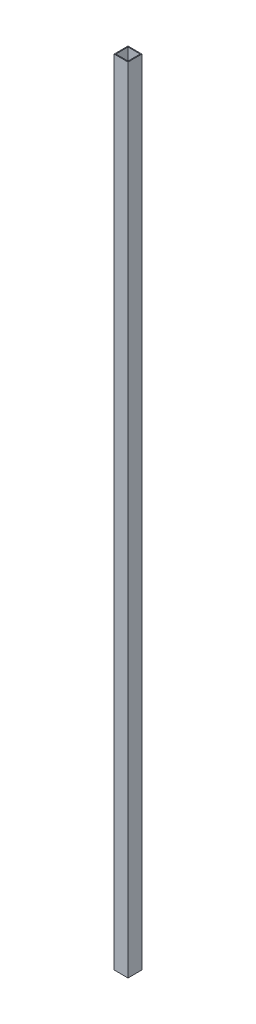
ISO-10303-21;
HEADER;
FILE_DESCRIPTION(('STEP AP214'),'2;1');
FILE_NAME('part.step','',(''),(''),'','','');
FILE_SCHEMA(('AUTOMOTIVE_DESIGN { 1 0 10303 214 1 1 1 1 }'));
ENDSEC;
DATA;
#1=APPLICATION_CONTEXT('core data for automotive mechanical design processes');
#2=APPLICATION_PROTOCOL_DEFINITION('international standard','automotive_design',2000,#1);
#3=PRODUCT_CONTEXT('',#1,'mechanical');
#4=PRODUCT('Part','Part','',(#3));
#5=PRODUCT_RELATED_PRODUCT_CATEGORY('part','',(#4));
#6=PRODUCT_DEFINITION_FORMATION('','',#4);
#7=PRODUCT_DEFINITION_CONTEXT('part definition',#1,'design');
#8=PRODUCT_DEFINITION('design','',#6,#7);
#9=PRODUCT_DEFINITION_SHAPE('','',#8);
#10=(LENGTH_UNIT() NAMED_UNIT(*) SI_UNIT(.MILLI.,.METRE.));
#11=(NAMED_UNIT(*) PLANE_ANGLE_UNIT() SI_UNIT($,.RADIAN.));
#12=(NAMED_UNIT(*) SI_UNIT($,.STERADIAN.) SOLID_ANGLE_UNIT());
#13=UNCERTAINTY_MEASURE_WITH_UNIT(LENGTH_MEASURE(1.E-05),#10,'distance_accuracy_value','');
#14=(GEOMETRIC_REPRESENTATION_CONTEXT(3) GLOBAL_UNCERTAINTY_ASSIGNED_CONTEXT((#13)) GLOBAL_UNIT_ASSIGNED_CONTEXT((#10,
#11,#12)) REPRESENTATION_CONTEXT('',''));
#15=CARTESIAN_POINT('',(0.,0.,0.));
#16=DIRECTION('',(0.,0.,1.));
#17=DIRECTION('',(1.,0.,0.));
#18=AXIS2_PLACEMENT_3D('',#15,#16,#17);
#19=CARTESIAN_POINT('',(0.,1447.8,0.));
#20=DIRECTION('',(0.,-1.,0.));
#21=DIRECTION('',(0.,0.,-1.));
#22=AXIS2_PLACEMENT_3D('',#19,#20,#21);
#23=PLANE('',#22);
#24=DIRECTION('',(0.,0.,-1.));
#25=VECTOR('',#24,1.);
#26=CARTESIAN_POINT('',(12.7,1447.8,12.7));
#27=LINE('',#26,#25);
#28=CARTESIAN_POINT('',(12.7,1447.8,12.7));
#29=VERTEX_POINT('',#28);
#30=CARTESIAN_POINT('',(12.7,1447.8,-12.7));
#31=VERTEX_POINT('',#30);
#32=EDGE_CURVE('E134',#29,#31,#27,.T.);
#33=ORIENTED_EDGE('',*,*,#32,.T.);
#34=DIRECTION('',(-1.,0.,0.));
#35=VECTOR('',#34,1.);
#36=CARTESIAN_POINT('',(-12.7,1447.8,-12.7));
#37=LINE('',#36,#35);
#38=CARTESIAN_POINT('',(-12.7,1447.8,-12.7));
#39=VERTEX_POINT('',#38);
#40=EDGE_CURVE('E137',#31,#39,#37,.T.);
#41=ORIENTED_EDGE('',*,*,#40,.T.);
#42=DIRECTION('',(0.,0.,1.));
#43=VECTOR('',#42,1.);
#44=CARTESIAN_POINT('',(-12.7,1447.8,12.7));
#45=LINE('',#44,#43);
#46=CARTESIAN_POINT('',(-12.7,1447.8,12.7));
#47=VERTEX_POINT('',#46);
#48=EDGE_CURVE('E140',#39,#47,#45,.T.);
#49=ORIENTED_EDGE('',*,*,#48,.T.);
#50=DIRECTION('',(1.,0.,0.));
#51=VECTOR('',#50,1.);
#52=CARTESIAN_POINT('',(-12.7,1447.8,12.7));
#53=LINE('',#52,#51);
#54=EDGE_CURVE('E142',#47,#29,#53,.T.);
#55=ORIENTED_EDGE('',*,*,#54,.T.);
#56=EDGE_LOOP('',(#33,#41,#49,#55));
#57=FACE_BOUND('',#56,.T.);
#58=DIRECTION('',(0.,0.,-1.));
#59=VECTOR('',#58,1.);
#60=CARTESIAN_POINT('',(11.1125,1447.8,11.1125));
#61=LINE('',#60,#59);
#62=CARTESIAN_POINT('',(11.1125,1447.8,11.1125));
#63=VERTEX_POINT('',#62);
#64=CARTESIAN_POINT('',(11.1125,1447.8,-11.1125));
#65=VERTEX_POINT('',#64);
#66=EDGE_CURVE('E98',#63,#65,#61,.T.);
#67=ORIENTED_EDGE('',*,*,#66,.F.);
#68=DIRECTION('',(1.,0.,0.));
#69=VECTOR('',#68,1.);
#70=CARTESIAN_POINT('',(-11.1125,1447.8,11.1125));
#71=LINE('',#70,#69);
#72=CARTESIAN_POINT('',(-11.1125,1447.8,11.1125));
#73=VERTEX_POINT('',#72);
#74=EDGE_CURVE('E120',#73,#63,#71,.T.);
#75=ORIENTED_EDGE('',*,*,#74,.F.);
#76=DIRECTION('',(0.,0.,1.));
#77=VECTOR('',#76,1.);
#78=CARTESIAN_POINT('',(-11.1125,1447.8,11.1125));
#79=LINE('',#78,#77);
#80=CARTESIAN_POINT('',(-11.1125,1447.8,-11.1125));
#81=VERTEX_POINT('',#80);
#82=EDGE_CURVE('E118',#81,#73,#79,.T.);
#83=ORIENTED_EDGE('',*,*,#82,.F.);
#84=DIRECTION('',(-1.,0.,0.));
#85=VECTOR('',#84,1.);
#86=CARTESIAN_POINT('',(-11.1125,1447.8,-11.1125));
#87=LINE('',#86,#85);
#88=EDGE_CURVE('E106',#65,#81,#87,.T.);
#89=ORIENTED_EDGE('',*,*,#88,.F.);
#90=EDGE_LOOP('',(#67,#75,#83,#89));
#91=FACE_BOUND('',#90,.T.);
#92=ADVANCED_FACE('F33',(#57,#91),#23,.F.);
#93=CARTESIAN_POINT('',(0.,0.,0.));
#94=DIRECTION('',(0.,-1.,0.));
#95=DIRECTION('',(0.,0.,-1.));
#96=AXIS2_PLACEMENT_3D('',#93,#94,#95);
#97=PLANE('',#96);
#98=DIRECTION('',(0.,0.,-1.));
#99=VECTOR('',#98,1.);
#100=CARTESIAN_POINT('',(12.7,0.,12.7));
#101=LINE('',#100,#99);
#102=CARTESIAN_POINT('',(12.7,0.,12.7));
#103=VERTEX_POINT('',#102);
#104=CARTESIAN_POINT('',(12.7,0.,-12.7));
#105=VERTEX_POINT('',#104);
#106=EDGE_CURVE('E114',#103,#105,#101,.T.);
#107=ORIENTED_EDGE('',*,*,#106,.F.);
#108=DIRECTION('',(1.,0.,0.));
#109=VECTOR('',#108,1.);
#110=CARTESIAN_POINT('',(-12.7,0.,12.7));
#111=LINE('',#110,#109);
#112=CARTESIAN_POINT('',(-12.7,0.,12.7));
#113=VERTEX_POINT('',#112);
#114=EDGE_CURVE('E138',#113,#103,#111,.T.);
#115=ORIENTED_EDGE('',*,*,#114,.F.);
#116=DIRECTION('',(0.,0.,1.));
#117=VECTOR('',#116,1.);
#118=CARTESIAN_POINT('',(-12.7,0.,12.7));
#119=LINE('',#118,#117);
#120=CARTESIAN_POINT('',(-12.7,0.,-12.7));
#121=VERTEX_POINT('',#120);
#122=EDGE_CURVE('E149',#121,#113,#119,.T.);
#123=ORIENTED_EDGE('',*,*,#122,.F.);
#124=DIRECTION('',(-1.,0.,0.));
#125=VECTOR('',#124,1.);
#126=CARTESIAN_POINT('',(-12.7,0.,-12.7));
#127=LINE('',#126,#125);
#128=EDGE_CURVE('E147',#105,#121,#127,.T.);
#129=ORIENTED_EDGE('',*,*,#128,.F.);
#130=EDGE_LOOP('',(#107,#115,#123,#129));
#131=FACE_BOUND('',#130,.T.);
#132=DIRECTION('',(1.,0.,0.));
#133=VECTOR('',#132,1.);
#134=CARTESIAN_POINT('',(-11.1125,0.,11.1125));
#135=LINE('',#134,#133);
#136=CARTESIAN_POINT('',(-11.1125,0.,11.1125));
#137=VERTEX_POINT('',#136);
#138=CARTESIAN_POINT('',(11.1125,0.,11.1125));
#139=VERTEX_POINT('',#138);
#140=EDGE_CURVE('E107',#137,#139,#135,.T.);
#141=ORIENTED_EDGE('',*,*,#140,.T.);
#142=DIRECTION('',(0.,0.,-1.));
#143=VECTOR('',#142,1.);
#144=CARTESIAN_POINT('',(11.1125,0.,11.1125));
#145=LINE('',#144,#143);
#146=CARTESIAN_POINT('',(11.1125,0.,-11.1125));
#147=VERTEX_POINT('',#146);
#148=EDGE_CURVE('E56',#139,#147,#145,.T.);
#149=ORIENTED_EDGE('',*,*,#148,.T.);
#150=DIRECTION('',(-1.,0.,0.));
#151=VECTOR('',#150,1.);
#152=CARTESIAN_POINT('',(-11.1125,0.,-11.1125));
#153=LINE('',#152,#151);
#154=CARTESIAN_POINT('',(-11.1125,0.,-11.1125));
#155=VERTEX_POINT('',#154);
#156=EDGE_CURVE('E113',#147,#155,#153,.T.);
#157=ORIENTED_EDGE('',*,*,#156,.T.);
#158=DIRECTION('',(0.,0.,1.));
#159=VECTOR('',#158,1.);
#160=CARTESIAN_POINT('',(-11.1125,0.,11.1125));
#161=LINE('',#160,#159);
#162=EDGE_CURVE('E126',#155,#137,#161,.T.);
#163=ORIENTED_EDGE('',*,*,#162,.T.);
#164=EDGE_LOOP('',(#141,#149,#157,#163));
#165=FACE_BOUND('',#164,.T.);
#166=ADVANCED_FACE('F167',(#131,#165),#97,.T.);
#167=CARTESIAN_POINT('',(12.7,1447.8,12.7));
#168=DIRECTION('',(-1.,0.,0.));
#169=DIRECTION('',(0.,0.,1.));
#170=AXIS2_PLACEMENT_3D('',#167,#168,#169);
#171=PLANE('',#170);
#172=ORIENTED_EDGE('',*,*,#106,.T.);
#173=DIRECTION('',(0.,-1.,0.));
#174=VECTOR('',#173,1.);
#175=CARTESIAN_POINT('',(12.7,1447.8,-12.7));
#176=LINE('',#175,#174);
#177=EDGE_CURVE('E11',#31,#105,#176,.T.);
#178=ORIENTED_EDGE('',*,*,#177,.F.);
#179=ORIENTED_EDGE('',*,*,#32,.F.);
#180=DIRECTION('',(0.,-1.,0.));
#181=VECTOR('',#180,1.);
#182=CARTESIAN_POINT('',(12.7,1447.8,12.7));
#183=LINE('',#182,#181);
#184=EDGE_CURVE('E144',#29,#103,#183,.T.);
#185=ORIENTED_EDGE('',*,*,#184,.T.);
#186=EDGE_LOOP('',(#172,#178,#179,#185));
#187=FACE_BOUND('',#186,.T.);
#188=ADVANCED_FACE('F35',(#187),#171,.F.);
#189=CARTESIAN_POINT('',(-12.7,1447.8,-12.7));
#190=DIRECTION('',(0.,0.,1.));
#191=DIRECTION('',(1.,0.,0.));
#192=AXIS2_PLACEMENT_3D('',#189,#190,#191);
#193=PLANE('',#192);
#194=ORIENTED_EDGE('',*,*,#128,.T.);
#195=DIRECTION('',(0.,-1.,0.));
#196=VECTOR('',#195,1.);
#197=CARTESIAN_POINT('',(-12.7,1447.8,-12.7));
#198=LINE('',#197,#196);
#199=EDGE_CURVE('E41',#39,#121,#198,.T.);
#200=ORIENTED_EDGE('',*,*,#199,.F.);
#201=ORIENTED_EDGE('',*,*,#40,.F.);
#202=ORIENTED_EDGE('',*,*,#177,.T.);
#203=EDGE_LOOP('',(#194,#200,#201,#202));
#204=FACE_BOUND('',#203,.T.);
#205=ADVANCED_FACE('F177',(#204),#193,.F.);
#206=CARTESIAN_POINT('',(-12.7,1447.8,12.7));
#207=DIRECTION('',(1.,0.,0.));
#208=DIRECTION('',(0.,0.,-1.));
#209=AXIS2_PLACEMENT_3D('',#206,#207,#208);
#210=PLANE('',#209);
#211=ORIENTED_EDGE('',*,*,#122,.T.);
#212=DIRECTION('',(0.,-1.,0.));
#213=VECTOR('',#212,1.);
#214=CARTESIAN_POINT('',(-12.7,1447.8,12.7));
#215=LINE('',#214,#213);
#216=EDGE_CURVE('E154',#47,#113,#215,.T.);
#217=ORIENTED_EDGE('',*,*,#216,.F.);
#218=ORIENTED_EDGE('',*,*,#48,.F.);
#219=ORIENTED_EDGE('',*,*,#199,.T.);
#220=EDGE_LOOP('',(#211,#217,#218,#219));
#221=FACE_BOUND('',#220,.T.);
#222=ADVANCED_FACE('F161',(#221),#210,.F.);
#223=CARTESIAN_POINT('',(-12.7,1447.8,12.7));
#224=DIRECTION('',(0.,0.,-1.));
#225=DIRECTION('',(-1.,0.,0.));
#226=AXIS2_PLACEMENT_3D('',#223,#224,#225);
#227=PLANE('',#226);
#228=ORIENTED_EDGE('',*,*,#114,.T.);
#229=ORIENTED_EDGE('',*,*,#184,.F.);
#230=ORIENTED_EDGE('',*,*,#54,.F.);
#231=ORIENTED_EDGE('',*,*,#216,.T.);
#232=EDGE_LOOP('',(#228,#229,#230,#231));
#233=FACE_BOUND('',#232,.T.);
#234=ADVANCED_FACE('F171',(#233),#227,.F.);
#235=CARTESIAN_POINT('',(11.1125,1447.8,11.1125));
#236=DIRECTION('',(-1.,0.,0.));
#237=DIRECTION('',(0.,0.,1.));
#238=AXIS2_PLACEMENT_3D('',#235,#236,#237);
#239=PLANE('',#238);
#240=ORIENTED_EDGE('',*,*,#148,.F.);
#241=DIRECTION('',(0.,-1.,0.));
#242=VECTOR('',#241,1.);
#243=CARTESIAN_POINT('',(11.1125,1447.8,11.1125));
#244=LINE('',#243,#242);
#245=EDGE_CURVE('E102',#63,#139,#244,.T.);
#246=ORIENTED_EDGE('',*,*,#245,.F.);
#247=ORIENTED_EDGE('',*,*,#66,.T.);
#248=DIRECTION('',(0.,-1.,0.));
#249=VECTOR('',#248,1.);
#250=CARTESIAN_POINT('',(11.1125,1447.8,-11.1125));
#251=LINE('',#250,#249);
#252=EDGE_CURVE('E101',#65,#147,#251,.T.);
#253=ORIENTED_EDGE('',*,*,#252,.T.);
#254=EDGE_LOOP('',(#240,#246,#247,#253));
#255=FACE_BOUND('',#254,.T.);
#256=ADVANCED_FACE('F100',(#255),#239,.T.);
#257=CARTESIAN_POINT('',(-11.1125,1447.8,-11.1125));
#258=DIRECTION('',(0.,0.,1.));
#259=DIRECTION('',(1.,0.,0.));
#260=AXIS2_PLACEMENT_3D('',#257,#258,#259);
#261=PLANE('',#260);
#262=ORIENTED_EDGE('',*,*,#156,.F.);
#263=ORIENTED_EDGE('',*,*,#252,.F.);
#264=ORIENTED_EDGE('',*,*,#88,.T.);
#265=DIRECTION('',(0.,-1.,0.));
#266=VECTOR('',#265,1.);
#267=CARTESIAN_POINT('',(-11.1125,1447.8,-11.1125));
#268=LINE('',#267,#266);
#269=EDGE_CURVE('E115',#81,#155,#268,.T.);
#270=ORIENTED_EDGE('',*,*,#269,.T.);
#271=EDGE_LOOP('',(#262,#263,#264,#270));
#272=FACE_BOUND('',#271,.T.);
#273=ADVANCED_FACE('F110',(#272),#261,.T.);
#274=CARTESIAN_POINT('',(-11.1125,1447.8,11.1125));
#275=DIRECTION('',(1.,0.,0.));
#276=DIRECTION('',(0.,0.,-1.));
#277=AXIS2_PLACEMENT_3D('',#274,#275,#276);
#278=PLANE('',#277);
#279=ORIENTED_EDGE('',*,*,#162,.F.);
#280=ORIENTED_EDGE('',*,*,#269,.F.);
#281=ORIENTED_EDGE('',*,*,#82,.T.);
#282=DIRECTION('',(0.,-1.,0.));
#283=VECTOR('',#282,1.);
#284=CARTESIAN_POINT('',(-11.1125,1447.8,11.1125));
#285=LINE('',#284,#283);
#286=EDGE_CURVE('E48',#73,#137,#285,.T.);
#287=ORIENTED_EDGE('',*,*,#286,.T.);
#288=EDGE_LOOP('',(#279,#280,#281,#287));
#289=FACE_BOUND('',#288,.T.);
#290=ADVANCED_FACE('F200',(#289),#278,.T.);
#291=CARTESIAN_POINT('',(-11.1125,1447.8,11.1125));
#292=DIRECTION('',(0.,0.,-1.));
#293=DIRECTION('',(-1.,0.,0.));
#294=AXIS2_PLACEMENT_3D('',#291,#292,#293);
#295=PLANE('',#294);
#296=ORIENTED_EDGE('',*,*,#140,.F.);
#297=ORIENTED_EDGE('',*,*,#286,.F.);
#298=ORIENTED_EDGE('',*,*,#74,.T.);
#299=ORIENTED_EDGE('',*,*,#245,.T.);
#300=EDGE_LOOP('',(#296,#297,#298,#299));
#301=FACE_BOUND('',#300,.T.);
#302=ADVANCED_FACE('F204',(#301),#295,.T.);
#303=CLOSED_SHELL('',(#92,#166,#188,#205,#222,#234,#256,#273,#290,#302));
#304=MANIFOLD_SOLID_BREP('B2',#303);
#305=ADVANCED_BREP_SHAPE_REPRESENTATION('',(#18,#304),#14);
#306=SHAPE_DEFINITION_REPRESENTATION(#9,#305);
ENDSEC;
END-ISO-10303-21;
